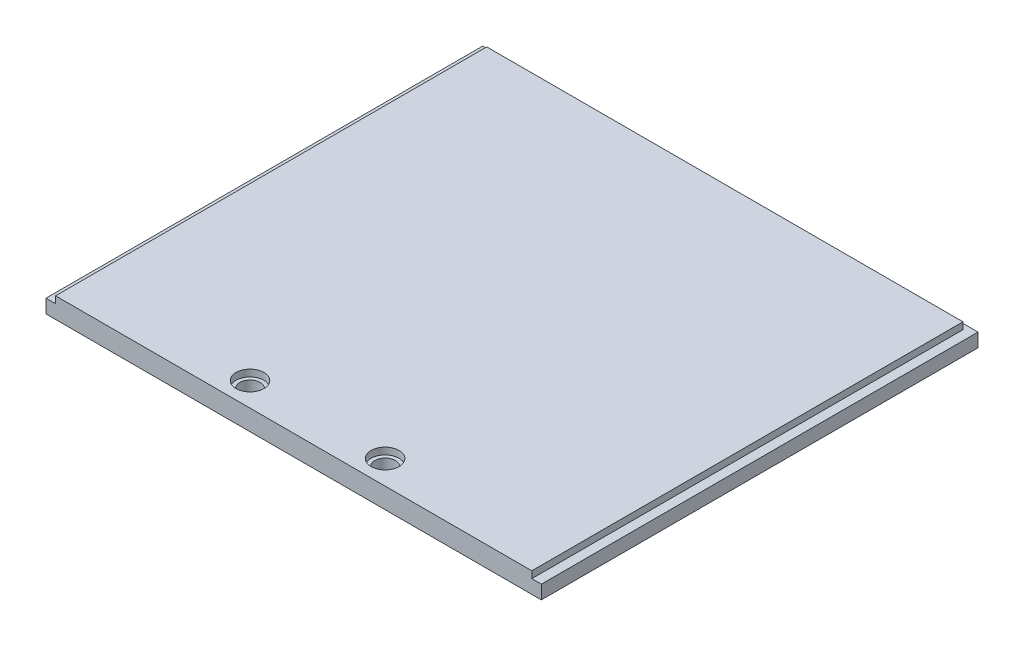
ISO-10303-21;
HEADER;
FILE_DESCRIPTION(('STEP AP214'),'2;1');
FILE_NAME('part.step','',(''),(''),'','','');
FILE_SCHEMA(('AUTOMOTIVE_DESIGN { 1 0 10303 214 1 1 1 1 }'));
ENDSEC;
DATA;
#1=APPLICATION_CONTEXT('core data for automotive mechanical design processes');
#2=APPLICATION_PROTOCOL_DEFINITION('international standard','automotive_design',2000,#1);
#3=PRODUCT_CONTEXT('',#1,'mechanical');
#4=PRODUCT('Part','Part','',(#3));
#5=PRODUCT_RELATED_PRODUCT_CATEGORY('part','',(#4));
#6=PRODUCT_DEFINITION_FORMATION('','',#4);
#7=PRODUCT_DEFINITION_CONTEXT('part definition',#1,'design');
#8=PRODUCT_DEFINITION('design','',#6,#7);
#9=PRODUCT_DEFINITION_SHAPE('','',#8);
#10=(LENGTH_UNIT() NAMED_UNIT(*) SI_UNIT(.MILLI.,.METRE.));
#11=(NAMED_UNIT(*) PLANE_ANGLE_UNIT() SI_UNIT($,.RADIAN.));
#12=(NAMED_UNIT(*) SI_UNIT($,.STERADIAN.) SOLID_ANGLE_UNIT());
#13=UNCERTAINTY_MEASURE_WITH_UNIT(LENGTH_MEASURE(1.E-05),#10,'distance_accuracy_value','');
#14=(GEOMETRIC_REPRESENTATION_CONTEXT(3) GLOBAL_UNCERTAINTY_ASSIGNED_CONTEXT((#13)) GLOBAL_UNIT_ASSIGNED_CONTEXT((#10,
#11,#12)) REPRESENTATION_CONTEXT('',''));
#15=CARTESIAN_POINT('',(0.,0.,0.));
#16=DIRECTION('',(0.,0.,1.));
#17=DIRECTION('',(1.,0.,0.));
#18=AXIS2_PLACEMENT_3D('',#15,#16,#17);
#19=CARTESIAN_POINT('',(0.,2.,0.));
#20=DIRECTION('',(0.,-1.,0.));
#21=DIRECTION('',(0.,0.,-1.));
#22=AXIS2_PLACEMENT_3D('',#19,#20,#21);
#23=PLANE('',#22);
#24=DIRECTION('',(0.,0.,1.));
#25=VECTOR('',#24,1.);
#26=CARTESIAN_POINT('',(1.4,2.,0.));
#27=LINE('',#26,#25);
#28=CARTESIAN_POINT('',(1.4,2.,-63.2));
#29=VERTEX_POINT('',#28);
#30=CARTESIAN_POINT('',(1.4,2.,0.));
#31=VERTEX_POINT('',#30);
#32=EDGE_CURVE('E48',#29,#31,#27,.T.);
#33=ORIENTED_EDGE('',*,*,#32,.F.);
#34=DIRECTION('',(-1.,0.,0.));
#35=VECTOR('',#34,1.);
#36=CARTESIAN_POINT('',(1.4,2.,-63.2));
#37=LINE('',#36,#35);
#38=CARTESIAN_POINT('',(71.2,2.,-63.2));
#39=VERTEX_POINT('',#38);
#40=EDGE_CURVE('E116',#39,#29,#37,.T.);
#41=ORIENTED_EDGE('',*,*,#40,.F.);
#42=DIRECTION('',(0.,0.,-1.));
#43=VECTOR('',#42,1.);
#44=CARTESIAN_POINT('',(71.2,2.,0.));
#45=LINE('',#44,#43);
#46=CARTESIAN_POINT('',(71.2,2.,0.));
#47=VERTEX_POINT('',#46);
#48=EDGE_CURVE('E54',#47,#39,#45,.T.);
#49=ORIENTED_EDGE('',*,*,#48,.F.);
#50=DIRECTION('',(1.,0.,0.));
#51=VECTOR('',#50,1.);
#52=CARTESIAN_POINT('',(0.,2.,0.));
#53=LINE('',#52,#51);
#54=CARTESIAN_POINT('',(72.6,2.,0.));
#55=VERTEX_POINT('',#54);
#56=EDGE_CURVE('E131',#47,#55,#53,.T.);
#57=ORIENTED_EDGE('',*,*,#56,.T.);
#58=DIRECTION('',(0.,0.,-1.));
#59=VECTOR('',#58,1.);
#60=CARTESIAN_POINT('',(72.6,2.,0.));
#61=LINE('',#60,#59);
#62=CARTESIAN_POINT('',(72.6,2.,-64.));
#63=VERTEX_POINT('',#62);
#64=EDGE_CURVE('E135',#55,#63,#61,.T.);
#65=ORIENTED_EDGE('',*,*,#64,.T.);
#66=DIRECTION('',(-1.,0.,0.));
#67=VECTOR('',#66,1.);
#68=CARTESIAN_POINT('',(0.,2.,-64.));
#69=LINE('',#68,#67);
#70=CARTESIAN_POINT('',(0.,2.,-64.));
#71=VERTEX_POINT('',#70);
#72=EDGE_CURVE('E137',#63,#71,#69,.T.);
#73=ORIENTED_EDGE('',*,*,#72,.T.);
#74=DIRECTION('',(0.,0.,1.));
#75=VECTOR('',#74,1.);
#76=CARTESIAN_POINT('',(0.,2.,0.));
#77=LINE('',#76,#75);
#78=CARTESIAN_POINT('',(0.,2.,0.));
#79=VERTEX_POINT('',#78);
#80=EDGE_CURVE('E128',#71,#79,#77,.T.);
#81=ORIENTED_EDGE('',*,*,#80,.T.);
#82=EDGE_CURVE('E133',#79,#31,#53,.T.);
#83=ORIENTED_EDGE('',*,*,#82,.T.);
#84=EDGE_LOOP('',(#33,#41,#49,#57,#65,#73,#81,#83));
#85=FACE_BOUND('',#84,.T.);
#86=ADVANCED_FACE('F33',(#85),#23,.F.);
#87=CARTESIAN_POINT('',(0.,2.,0.));
#88=DIRECTION('',(1.,0.,0.));
#89=DIRECTION('',(0.,0.,-1.));
#90=AXIS2_PLACEMENT_3D('',#87,#88,#89);
#91=PLANE('',#90);
#92=DIRECTION('',(0.,0.,1.));
#93=VECTOR('',#92,1.);
#94=CARTESIAN_POINT('',(0.,0.,0.));
#95=LINE('',#94,#93);
#96=CARTESIAN_POINT('',(0.,0.,-64.));
#97=VERTEX_POINT('',#96);
#98=CARTESIAN_POINT('',(0.,0.,0.));
#99=VERTEX_POINT('',#98);
#100=EDGE_CURVE('E119',#97,#99,#95,.T.);
#101=ORIENTED_EDGE('',*,*,#100,.T.);
#102=DIRECTION('',(0.,-1.,0.));
#103=VECTOR('',#102,1.);
#104=CARTESIAN_POINT('',(0.,2.,0.));
#105=LINE('',#104,#103);
#106=EDGE_CURVE('E11',#79,#99,#105,.T.);
#107=ORIENTED_EDGE('',*,*,#106,.F.);
#108=ORIENTED_EDGE('',*,*,#80,.F.);
#109=DIRECTION('',(0.,-1.,0.));
#110=VECTOR('',#109,1.);
#111=CARTESIAN_POINT('',(0.,2.,-64.));
#112=LINE('',#111,#110);
#113=EDGE_CURVE('E138',#71,#97,#112,.T.);
#114=ORIENTED_EDGE('',*,*,#113,.T.);
#115=EDGE_LOOP('',(#101,#107,#108,#114));
#116=FACE_BOUND('',#115,.T.);
#117=ADVANCED_FACE('F35',(#116),#91,.F.);
#118=CARTESIAN_POINT('',(0.,2.,0.));
#119=DIRECTION('',(0.,0.,-1.));
#120=DIRECTION('',(-1.,0.,0.));
#121=AXIS2_PLACEMENT_3D('',#118,#119,#120);
#122=PLANE('',#121);
#123=DIRECTION('',(1.,0.,0.));
#124=VECTOR('',#123,1.);
#125=CARTESIAN_POINT('',(0.,0.,0.));
#126=LINE('',#125,#124);
#127=CARTESIAN_POINT('',(72.6,0.,0.));
#128=VERTEX_POINT('',#127);
#129=EDGE_CURVE('E122',#99,#128,#126,.T.);
#130=ORIENTED_EDGE('',*,*,#129,.T.);
#131=DIRECTION('',(0.,-1.,0.));
#132=VECTOR('',#131,1.);
#133=CARTESIAN_POINT('',(72.6,2.,0.));
#134=LINE('',#133,#132);
#135=EDGE_CURVE('E41',#55,#128,#134,.T.);
#136=ORIENTED_EDGE('',*,*,#135,.F.);
#137=ORIENTED_EDGE('',*,*,#56,.F.);
#138=DIRECTION('',(0.,-1.,0.));
#139=VECTOR('',#138,1.);
#140=CARTESIAN_POINT('',(71.2,3.,0.));
#141=LINE('',#140,#139);
#142=CARTESIAN_POINT('',(71.2,3.,0.));
#143=VERTEX_POINT('',#142);
#144=EDGE_CURVE('E103',#143,#47,#141,.T.);
#145=ORIENTED_EDGE('',*,*,#144,.F.);
#146=DIRECTION('',(1.,0.,0.));
#147=VECTOR('',#146,1.);
#148=CARTESIAN_POINT('',(1.4,3.,0.));
#149=LINE('',#148,#147);
#150=CARTESIAN_POINT('',(1.4,3.,0.));
#151=VERTEX_POINT('',#150);
#152=EDGE_CURVE('E97',#151,#143,#149,.T.);
#153=ORIENTED_EDGE('',*,*,#152,.F.);
#154=DIRECTION('',(0.,-1.,0.));
#155=VECTOR('',#154,1.);
#156=CARTESIAN_POINT('',(1.4,3.,0.));
#157=LINE('',#156,#155);
#158=EDGE_CURVE('E101',#151,#31,#157,.T.);
#159=ORIENTED_EDGE('',*,*,#158,.T.);
#160=ORIENTED_EDGE('',*,*,#82,.F.);
#161=ORIENTED_EDGE('',*,*,#106,.T.);
#162=EDGE_LOOP('',(#130,#136,#137,#145,#153,#159,#160,#161));
#163=FACE_BOUND('',#162,.T.);
#164=ADVANCED_FACE('F99',(#163),#122,.F.);
#165=CARTESIAN_POINT('',(72.6,2.,0.));
#166=DIRECTION('',(-1.,0.,0.));
#167=DIRECTION('',(0.,0.,1.));
#168=AXIS2_PLACEMENT_3D('',#165,#166,#167);
#169=PLANE('',#168);
#170=DIRECTION('',(0.,0.,-1.));
#171=VECTOR('',#170,1.);
#172=CARTESIAN_POINT('',(72.6,0.,0.));
#173=LINE('',#172,#171);
#174=CARTESIAN_POINT('',(72.6,0.,-64.));
#175=VERTEX_POINT('',#174);
#176=EDGE_CURVE('E141',#128,#175,#173,.T.);
#177=ORIENTED_EDGE('',*,*,#176,.T.);
#178=DIRECTION('',(0.,-1.,0.));
#179=VECTOR('',#178,1.);
#180=CARTESIAN_POINT('',(72.6,2.,-64.));
#181=LINE('',#180,#179);
#182=EDGE_CURVE('E146',#63,#175,#181,.T.);
#183=ORIENTED_EDGE('',*,*,#182,.F.);
#184=ORIENTED_EDGE('',*,*,#64,.F.);
#185=ORIENTED_EDGE('',*,*,#135,.T.);
#186=EDGE_LOOP('',(#177,#183,#184,#185));
#187=FACE_BOUND('',#186,.T.);
#188=ADVANCED_FACE('F153',(#187),#169,.F.);
#189=CARTESIAN_POINT('',(0.,2.,-64.));
#190=DIRECTION('',(0.,0.,1.));
#191=DIRECTION('',(1.,0.,0.));
#192=AXIS2_PLACEMENT_3D('',#189,#190,#191);
#193=PLANE('',#192);
#194=DIRECTION('',(-1.,0.,0.));
#195=VECTOR('',#194,1.);
#196=CARTESIAN_POINT('',(0.,0.,-64.));
#197=LINE('',#196,#195);
#198=EDGE_CURVE('E132',#175,#97,#197,.T.);
#199=ORIENTED_EDGE('',*,*,#198,.T.);
#200=ORIENTED_EDGE('',*,*,#113,.F.);
#201=ORIENTED_EDGE('',*,*,#72,.F.);
#202=ORIENTED_EDGE('',*,*,#182,.T.);
#203=EDGE_LOOP('',(#199,#200,#201,#202));
#204=FACE_BOUND('',#203,.T.);
#205=ADVANCED_FACE('F161',(#204),#193,.F.);
#206=CARTESIAN_POINT('',(0.,0.,0.));
#207=DIRECTION('',(0.,-1.,0.));
#208=DIRECTION('',(0.,0.,-1.));
#209=AXIS2_PLACEMENT_3D('',#206,#207,#208);
#210=PLANE('',#209);
#211=CARTESIAN_POINT('',(26.4,0.,-3.5));
#212=DIRECTION('',(0.,1.,0.));
#213=DIRECTION('',(0.,0.,1.));
#214=AXIS2_PLACEMENT_3D('',#211,#212,#213);
#215=CIRCLE('',#214,1.50000000000001);
#216=CARTESIAN_POINT('',(26.4,0.,-1.99999999999999));
#217=VERTEX_POINT('',#216);
#218=EDGE_CURVE('E315',#217,#217,#215,.T.);
#219=ORIENTED_EDGE('',*,*,#218,.T.);
#220=EDGE_LOOP('',(#219));
#221=FACE_BOUND('',#220,.T.);
#222=CARTESIAN_POINT('',(46.2,0.,-3.5));
#223=DIRECTION('',(0.,1.,0.));
#224=DIRECTION('',(0.,0.,1.));
#225=AXIS2_PLACEMENT_3D('',#222,#223,#224);
#226=CIRCLE('',#225,1.50000000000002);
#227=CARTESIAN_POINT('',(46.2,0.,-1.99999999999998));
#228=VERTEX_POINT('',#227);
#229=EDGE_CURVE('E175',#228,#228,#226,.T.);
#230=ORIENTED_EDGE('',*,*,#229,.T.);
#231=EDGE_LOOP('',(#230));
#232=FACE_BOUND('',#231,.T.);
#233=ORIENTED_EDGE('',*,*,#100,.F.);
#234=ORIENTED_EDGE('',*,*,#198,.F.);
#235=ORIENTED_EDGE('',*,*,#176,.F.);
#236=ORIENTED_EDGE('',*,*,#129,.F.);
#237=EDGE_LOOP('',(#233,#234,#235,#236));
#238=FACE_BOUND('',#237,.T.);
#239=ADVANCED_FACE('F158',(#221,#232,#238),#210,.T.);
#240=CARTESIAN_POINT('',(1.4,3.,0.));
#241=DIRECTION('',(1.,0.,0.));
#242=DIRECTION('',(0.,0.,-1.));
#243=AXIS2_PLACEMENT_3D('',#240,#241,#242);
#244=PLANE('',#243);
#245=ORIENTED_EDGE('',*,*,#32,.T.);
#246=ORIENTED_EDGE('',*,*,#158,.F.);
#247=DIRECTION('',(0.,0.,1.));
#248=VECTOR('',#247,1.);
#249=CARTESIAN_POINT('',(1.4,3.,0.));
#250=LINE('',#249,#248);
#251=CARTESIAN_POINT('',(1.4,3.,-63.2));
#252=VERTEX_POINT('',#251);
#253=EDGE_CURVE('E107',#252,#151,#250,.T.);
#254=ORIENTED_EDGE('',*,*,#253,.F.);
#255=DIRECTION('',(0.,-1.,0.));
#256=VECTOR('',#255,1.);
#257=CARTESIAN_POINT('',(1.4,3.,-63.2));
#258=LINE('',#257,#256);
#259=EDGE_CURVE('E171',#252,#29,#258,.T.);
#260=ORIENTED_EDGE('',*,*,#259,.T.);
#261=EDGE_LOOP('',(#245,#246,#254,#260));
#262=FACE_BOUND('',#261,.T.);
#263=ADVANCED_FACE('F118',(#262),#244,.F.);
#264=CARTESIAN_POINT('',(71.2,3.,0.));
#265=DIRECTION('',(-1.,0.,0.));
#266=DIRECTION('',(0.,0.,1.));
#267=AXIS2_PLACEMENT_3D('',#264,#265,#266);
#268=PLANE('',#267);
#269=ORIENTED_EDGE('',*,*,#48,.T.);
#270=DIRECTION('',(0.,-1.,0.));
#271=VECTOR('',#270,1.);
#272=CARTESIAN_POINT('',(71.2,3.,-63.2));
#273=LINE('',#272,#271);
#274=CARTESIAN_POINT('',(71.2,3.,-63.2));
#275=VERTEX_POINT('',#274);
#276=EDGE_CURVE('E124',#275,#39,#273,.T.);
#277=ORIENTED_EDGE('',*,*,#276,.F.);
#278=DIRECTION('',(0.,0.,-1.));
#279=VECTOR('',#278,1.);
#280=CARTESIAN_POINT('',(71.2,3.,0.));
#281=LINE('',#280,#279);
#282=EDGE_CURVE('E106',#143,#275,#281,.T.);
#283=ORIENTED_EDGE('',*,*,#282,.F.);
#284=ORIENTED_EDGE('',*,*,#144,.T.);
#285=EDGE_LOOP('',(#269,#277,#283,#284));
#286=FACE_BOUND('',#285,.T.);
#287=ADVANCED_FACE('F167',(#286),#268,.F.);
#288=CARTESIAN_POINT('',(1.4,3.,-63.2));
#289=DIRECTION('',(0.,0.,1.));
#290=DIRECTION('',(1.,0.,0.));
#291=AXIS2_PLACEMENT_3D('',#288,#289,#290);
#292=PLANE('',#291);
#293=ORIENTED_EDGE('',*,*,#40,.T.);
#294=ORIENTED_EDGE('',*,*,#259,.F.);
#295=DIRECTION('',(-1.,0.,0.));
#296=VECTOR('',#295,1.);
#297=CARTESIAN_POINT('',(1.4,3.,-63.2));
#298=LINE('',#297,#296);
#299=EDGE_CURVE('E112',#275,#252,#298,.T.);
#300=ORIENTED_EDGE('',*,*,#299,.F.);
#301=ORIENTED_EDGE('',*,*,#276,.T.);
#302=EDGE_LOOP('',(#293,#294,#300,#301));
#303=FACE_BOUND('',#302,.T.);
#304=ADVANCED_FACE('F179',(#303),#292,.F.);
#305=CARTESIAN_POINT('',(0.,3.,0.));
#306=DIRECTION('',(0.,-1.,0.));
#307=DIRECTION('',(0.,0.,-1.));
#308=AXIS2_PLACEMENT_3D('',#305,#306,#307);
#309=PLANE('',#308);
#310=CARTESIAN_POINT('',(26.4,3.,-3.5));
#311=DIRECTION('',(0.,1.,0.));
#312=DIRECTION('',(0.,0.,1.));
#313=AXIS2_PLACEMENT_3D('',#310,#311,#312);
#314=CIRCLE('',#313,2.05000000000001);
#315=CARTESIAN_POINT('',(26.4,3.,-1.44999999999999));
#316=VERTEX_POINT('',#315);
#317=EDGE_CURVE('E308',#316,#316,#314,.T.);
#318=ORIENTED_EDGE('',*,*,#317,.F.);
#319=EDGE_LOOP('',(#318));
#320=FACE_BOUND('',#319,.T.);
#321=CARTESIAN_POINT('',(46.2,3.,-3.5));
#322=DIRECTION('',(0.,1.,0.));
#323=DIRECTION('',(0.,0.,1.));
#324=AXIS2_PLACEMENT_3D('',#321,#322,#323);
#325=CIRCLE('',#324,2.05000000000002);
#326=CARTESIAN_POINT('',(46.2,3.,-1.44999999999998));
#327=VERTEX_POINT('',#326);
#328=EDGE_CURVE('E318',#327,#327,#325,.T.);
#329=ORIENTED_EDGE('',*,*,#328,.F.);
#330=EDGE_LOOP('',(#329));
#331=FACE_BOUND('',#330,.T.);
#332=ORIENTED_EDGE('',*,*,#253,.T.);
#333=ORIENTED_EDGE('',*,*,#152,.T.);
#334=ORIENTED_EDGE('',*,*,#282,.T.);
#335=ORIENTED_EDGE('',*,*,#299,.T.);
#336=EDGE_LOOP('',(#332,#333,#334,#335));
#337=FACE_BOUND('',#336,.T.);
#338=ADVANCED_FACE('F110',(#320,#331,#337),#309,.F.);
#339=CARTESIAN_POINT('',(46.2,3.,-3.5));
#340=DIRECTION('',(0.,1.,0.));
#341=DIRECTION('',(0.,0.,1.));
#342=AXIS2_PLACEMENT_3D('',#339,#340,#341);
#343=CYLINDRICAL_SURFACE('',#342,1.50000000000002);
#344=ORIENTED_EDGE('',*,*,#229,.F.);
#345=EDGE_LOOP('',(#344));
#346=FACE_BOUND('',#345,.T.);
#347=CARTESIAN_POINT('',(46.2,2.,-3.5));
#348=DIRECTION('',(0.,1.,0.));
#349=DIRECTION('',(0.,0.,1.));
#350=AXIS2_PLACEMENT_3D('',#347,#348,#349);
#351=CIRCLE('',#350,1.50000000000002);
#352=CARTESIAN_POINT('',(46.2,2.,-1.99999999999998));
#353=VERTEX_POINT('',#352);
#354=EDGE_CURVE('E324',#353,#353,#351,.T.);
#355=ORIENTED_EDGE('',*,*,#354,.T.);
#356=EDGE_LOOP('',(#355));
#357=FACE_BOUND('',#356,.T.);
#358=ADVANCED_FACE('F186',(#346,#357),#343,.F.);
#359=CARTESIAN_POINT('',(47.7,2.,-3.5));
#360=DIRECTION('',(0.,-1.,0.));
#361=DIRECTION('',(0.,0.,-1.));
#362=AXIS2_PLACEMENT_3D('',#359,#360,#361);
#363=PLANE('',#362);
#364=ORIENTED_EDGE('',*,*,#354,.F.);
#365=EDGE_LOOP('',(#364));
#366=FACE_BOUND('',#365,.T.);
#367=CARTESIAN_POINT('',(46.2,2.,-3.5));
#368=DIRECTION('',(0.,1.,0.));
#369=DIRECTION('',(0.,0.,1.));
#370=AXIS2_PLACEMENT_3D('',#367,#368,#369);
#371=CIRCLE('',#370,2.05000000000001);
#372=CARTESIAN_POINT('',(46.2,2.,-1.44999999999999));
#373=VERTEX_POINT('',#372);
#374=EDGE_CURVE('E321',#373,#373,#371,.T.);
#375=ORIENTED_EDGE('',*,*,#374,.T.);
#376=EDGE_LOOP('',(#375));
#377=FACE_BOUND('',#376,.T.);
#378=ADVANCED_FACE('F248',(#366,#377),#363,.F.);
#379=CARTESIAN_POINT('',(46.2,3.,-3.5));
#380=DIRECTION('',(0.,1.,0.));
#381=DIRECTION('',(0.,0.,1.));
#382=AXIS2_PLACEMENT_3D('',#379,#380,#381);
#383=CYLINDRICAL_SURFACE('',#382,2.05000000000001);
#384=ORIENTED_EDGE('',*,*,#374,.F.);
#385=EDGE_LOOP('',(#384));
#386=FACE_BOUND('',#385,.T.);
#387=ORIENTED_EDGE('',*,*,#328,.T.);
#388=EDGE_LOOP('',(#387));
#389=FACE_BOUND('',#388,.T.);
#390=ADVANCED_FACE('F257',(#386,#389),#383,.F.);
#391=CARTESIAN_POINT('',(26.4,3.,-3.5));
#392=DIRECTION('',(0.,1.,0.));
#393=DIRECTION('',(0.,0.,1.));
#394=AXIS2_PLACEMENT_3D('',#391,#392,#393);
#395=CYLINDRICAL_SURFACE('',#394,1.50000000000001);
#396=ORIENTED_EDGE('',*,*,#218,.F.);
#397=EDGE_LOOP('',(#396));
#398=FACE_BOUND('',#397,.T.);
#399=CARTESIAN_POINT('',(26.4,2.,-3.5));
#400=DIRECTION('',(0.,1.,0.));
#401=DIRECTION('',(0.,0.,1.));
#402=AXIS2_PLACEMENT_3D('',#399,#400,#401);
#403=CIRCLE('',#402,1.50000000000002);
#404=CARTESIAN_POINT('',(26.4,2.,-1.99999999999998));
#405=VERTEX_POINT('',#404);
#406=EDGE_CURVE('E310',#405,#405,#403,.T.);
#407=ORIENTED_EDGE('',*,*,#406,.T.);
#408=EDGE_LOOP('',(#407));
#409=FACE_BOUND('',#408,.T.);
#410=ADVANCED_FACE('F266',(#398,#409),#395,.F.);
#411=CARTESIAN_POINT('',(27.9,2.,-3.5));
#412=DIRECTION('',(0.,-1.,0.));
#413=DIRECTION('',(0.,0.,-1.));
#414=AXIS2_PLACEMENT_3D('',#411,#412,#413);
#415=PLANE('',#414);
#416=ORIENTED_EDGE('',*,*,#406,.F.);
#417=EDGE_LOOP('',(#416));
#418=FACE_BOUND('',#417,.T.);
#419=CARTESIAN_POINT('',(26.4,2.,-3.5));
#420=DIRECTION('',(0.,1.,0.));
#421=DIRECTION('',(0.,0.,1.));
#422=AXIS2_PLACEMENT_3D('',#419,#420,#421);
#423=CIRCLE('',#422,2.05000000000001);
#424=CARTESIAN_POINT('',(26.4,2.,-1.44999999999999));
#425=VERTEX_POINT('',#424);
#426=EDGE_CURVE('E305',#425,#425,#423,.T.);
#427=ORIENTED_EDGE('',*,*,#426,.T.);
#428=EDGE_LOOP('',(#427));
#429=FACE_BOUND('',#428,.T.);
#430=ADVANCED_FACE('F275',(#418,#429),#415,.F.);
#431=CARTESIAN_POINT('',(26.4,3.,-3.5));
#432=DIRECTION('',(0.,1.,0.));
#433=DIRECTION('',(0.,0.,1.));
#434=AXIS2_PLACEMENT_3D('',#431,#432,#433);
#435=CYLINDRICAL_SURFACE('',#434,2.05000000000001);
#436=ORIENTED_EDGE('',*,*,#426,.F.);
#437=EDGE_LOOP('',(#436));
#438=FACE_BOUND('',#437,.T.);
#439=ORIENTED_EDGE('',*,*,#317,.T.);
#440=EDGE_LOOP('',(#439));
#441=FACE_BOUND('',#440,.T.);
#442=ADVANCED_FACE('F284',(#438,#441),#435,.F.);
#443=CLOSED_SHELL('',(#86,#117,#164,#188,#205,#239,#263,#287,#304,#338,#358,#378,#390,#410,#430,#442));
#444=MANIFOLD_SOLID_BREP('B2',#443);
#445=ADVANCED_BREP_SHAPE_REPRESENTATION('',(#18,#444),#14);
#446=SHAPE_DEFINITION_REPRESENTATION(#9,#445);
ENDSEC;
END-ISO-10303-21;
